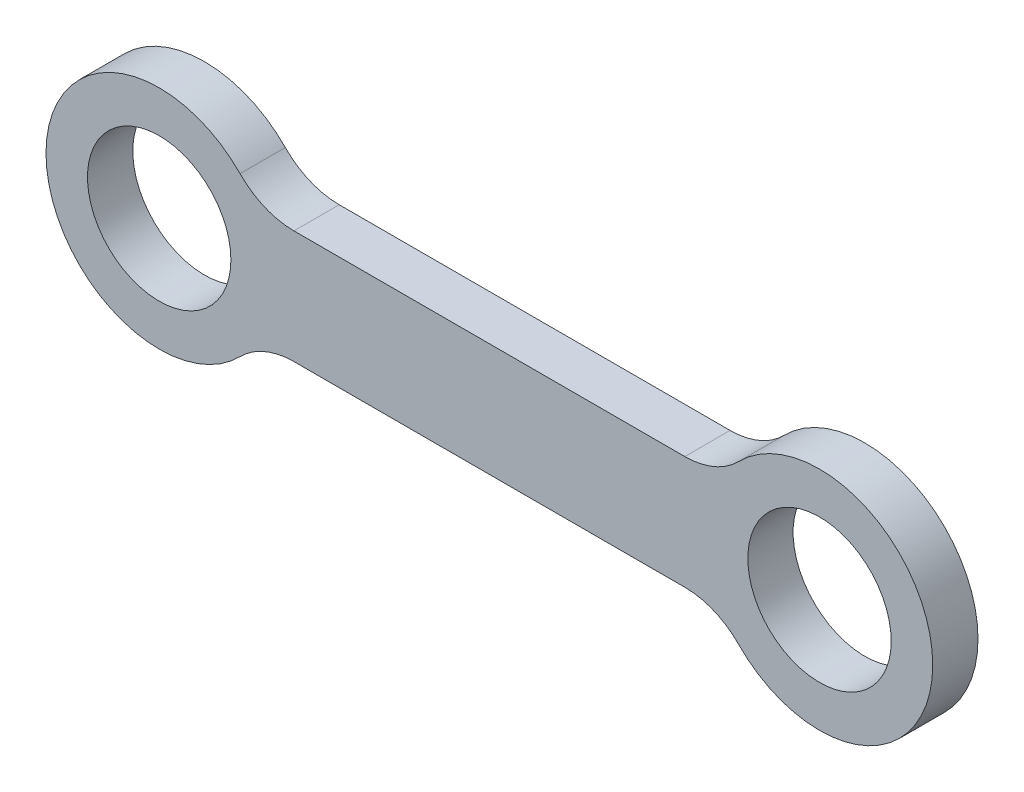
ISO-10303-21;
HEADER;
FILE_DESCRIPTION(('STEP AP214'),'2;1');
FILE_NAME('part.step','',(''),(''),'','','');
FILE_SCHEMA(('AUTOMOTIVE_DESIGN { 1 0 10303 214 1 1 1 1 }'));
ENDSEC;
DATA;
#1=APPLICATION_CONTEXT('core data for automotive mechanical design processes');
#2=APPLICATION_PROTOCOL_DEFINITION('international standard','automotive_design',2000,#1);
#3=PRODUCT_CONTEXT('',#1,'mechanical');
#4=PRODUCT('Part','Part','',(#3));
#5=PRODUCT_RELATED_PRODUCT_CATEGORY('part','',(#4));
#6=PRODUCT_DEFINITION_FORMATION('','',#4);
#7=PRODUCT_DEFINITION_CONTEXT('part definition',#1,'design');
#8=PRODUCT_DEFINITION('design','',#6,#7);
#9=PRODUCT_DEFINITION_SHAPE('','',#8);
#10=(LENGTH_UNIT() NAMED_UNIT(*) SI_UNIT(.MILLI.,.METRE.));
#11=(NAMED_UNIT(*) PLANE_ANGLE_UNIT() SI_UNIT($,.RADIAN.));
#12=(NAMED_UNIT(*) SI_UNIT($,.STERADIAN.) SOLID_ANGLE_UNIT());
#13=UNCERTAINTY_MEASURE_WITH_UNIT(LENGTH_MEASURE(1.E-05),#10,'distance_accuracy_value','');
#14=(GEOMETRIC_REPRESENTATION_CONTEXT(3) GLOBAL_UNCERTAINTY_ASSIGNED_CONTEXT((#13)) GLOBAL_UNIT_ASSIGNED_CONTEXT((#10,
#11,#12)) REPRESENTATION_CONTEXT('',''));
#15=CARTESIAN_POINT('',(0.,0.,0.));
#16=DIRECTION('',(0.,0.,1.));
#17=DIRECTION('',(1.,0.,0.));
#18=AXIS2_PLACEMENT_3D('',#15,#16,#17);
#19=CARTESIAN_POINT('',(-87.5,0.,3.));
#20=DIRECTION('',(0.,0.,-1.));
#21=DIRECTION('',(-1.,0.,0.));
#22=AXIS2_PLACEMENT_3D('',#19,#20,#21);
#23=CYLINDRICAL_SURFACE('',#22,15.);
#24=CARTESIAN_POINT('',(-87.5,0.,-3.));
#25=DIRECTION('',(0.,0.,1.));
#26=DIRECTION('',(1.,0.,0.));
#27=AXIS2_PLACEMENT_3D('',#24,#25,#26);
#28=CIRCLE('',#27,15.);
#29=CARTESIAN_POINT('',(-76.7878573571857,10.5,-3.));
#30=VERTEX_POINT('',#29);
#31=CARTESIAN_POINT('',(-76.7878573571857,-10.5,-3.));
#32=VERTEX_POINT('',#31);
#33=EDGE_CURVE('E161',#30,#32,#28,.T.);
#34=ORIENTED_EDGE('',*,*,#33,.T.);
#35=DIRECTION('',(0.,0.,-1.));
#36=VECTOR('',#35,1.);
#37=CARTESIAN_POINT('',(-76.7878573571857,-10.5,3.));
#38=LINE('',#37,#36);
#39=CARTESIAN_POINT('',(-76.7878573571857,-10.5,3.));
#40=VERTEX_POINT('',#39);
#41=EDGE_CURVE('E177',#32,#40,#38,.F.);
#42=ORIENTED_EDGE('',*,*,#41,.T.);
#43=CARTESIAN_POINT('',(-87.5,0.,3.));
#44=DIRECTION('',(0.,0.,1.));
#45=DIRECTION('',(1.,0.,0.));
#46=AXIS2_PLACEMENT_3D('',#43,#44,#45);
#47=CIRCLE('',#46,15.);
#48=CARTESIAN_POINT('',(-76.7878573571857,10.5,3.));
#49=VERTEX_POINT('',#48);
#50=EDGE_CURVE('E207',#49,#40,#47,.T.);
#51=ORIENTED_EDGE('',*,*,#50,.F.);
#52=DIRECTION('',(0.,0.,-1.));
#53=VECTOR('',#52,1.);
#54=CARTESIAN_POINT('',(-76.7878573571857,10.5,3.));
#55=LINE('',#54,#53);
#56=EDGE_CURVE('E173',#49,#30,#55,.T.);
#57=ORIENTED_EDGE('',*,*,#56,.T.);
#58=EDGE_LOOP('',(#34,#42,#51,#57));
#59=FACE_BOUND('',#58,.T.);
#60=ADVANCED_FACE('F41',(#59),#23,.T.);
#61=CARTESIAN_POINT('',(0.,-7.49999999999999,3.));
#62=DIRECTION('',(0.,1.,0.));
#63=DIRECTION('',(-1.,0.,0.));
#64=AXIS2_PLACEMENT_3D('',#61,#62,#63);
#65=PLANE('',#64);
#66=DIRECTION('',(1.,0.,0.));
#67=VECTOR('',#66,1.);
#68=CARTESIAN_POINT('',(0.,-7.49999999999999,-3.));
#69=LINE('',#68,#67);
#70=CARTESIAN_POINT('',(-69.6464289286428,-7.50000000000001,-3.));
#71=VERTEX_POINT('',#70);
#72=CARTESIAN_POINT('',(-17.8535710713571,-7.49999999999999,-3.));
#73=VERTEX_POINT('',#72);
#74=EDGE_CURVE('E155',#71,#73,#69,.T.);
#75=ORIENTED_EDGE('',*,*,#74,.T.);
#76=DIRECTION('',(0.,0.,1.));
#77=VECTOR('',#76,1.);
#78=CARTESIAN_POINT('',(-17.8535710713571,-7.49999999999999,3.));
#79=LINE('',#78,#77);
#80=CARTESIAN_POINT('',(-17.8535710713571,-7.49999999999999,3.));
#81=VERTEX_POINT('',#80);
#82=EDGE_CURVE('E129',#73,#81,#79,.T.);
#83=ORIENTED_EDGE('',*,*,#82,.T.);
#84=DIRECTION('',(1.,0.,0.));
#85=VECTOR('',#84,1.);
#86=CARTESIAN_POINT('',(0.,-7.49999999999999,3.));
#87=LINE('',#86,#85);
#88=CARTESIAN_POINT('',(-69.6464289286428,-7.50000000000001,3.));
#89=VERTEX_POINT('',#88);
#90=EDGE_CURVE('E212',#89,#81,#87,.T.);
#91=ORIENTED_EDGE('',*,*,#90,.F.);
#92=DIRECTION('',(0.,0.,1.));
#93=VECTOR('',#92,1.);
#94=CARTESIAN_POINT('',(-69.6464289286428,-7.50000000000001,-3.));
#95=LINE('',#94,#93);
#96=EDGE_CURVE('E146',#89,#71,#95,.F.);
#97=ORIENTED_EDGE('',*,*,#96,.T.);
#98=EDGE_LOOP('',(#75,#83,#91,#97));
#99=FACE_BOUND('',#98,.T.);
#100=ADVANCED_FACE('F239',(#99),#65,.F.);
#101=CARTESIAN_POINT('',(0.,0.,3.));
#102=DIRECTION('',(0.,0.,-1.));
#103=DIRECTION('',(-1.,0.,0.));
#104=AXIS2_PLACEMENT_3D('',#101,#102,#103);
#105=CYLINDRICAL_SURFACE('',#104,15.);
#106=CARTESIAN_POINT('',(0.,0.,3.));
#107=DIRECTION('',(0.,0.,1.));
#108=DIRECTION('',(1.,0.,0.));
#109=AXIS2_PLACEMENT_3D('',#106,#107,#108);
#110=CIRCLE('',#109,15.);
#111=CARTESIAN_POINT('',(-10.7121426428143,-10.5,3.));
#112=VERTEX_POINT('',#111);
#113=CARTESIAN_POINT('',(-10.7121426428143,10.5,3.));
#114=VERTEX_POINT('',#113);
#115=EDGE_CURVE('E144',#112,#114,#110,.T.);
#116=ORIENTED_EDGE('',*,*,#115,.F.);
#117=DIRECTION('',(0.,0.,-1.));
#118=VECTOR('',#117,1.);
#119=CARTESIAN_POINT('',(-10.7121426428143,-10.5,3.));
#120=LINE('',#119,#118);
#121=CARTESIAN_POINT('',(-10.7121426428143,-10.5,-3.));
#122=VERTEX_POINT('',#121);
#123=EDGE_CURVE('E128',#112,#122,#120,.T.);
#124=ORIENTED_EDGE('',*,*,#123,.T.);
#125=CARTESIAN_POINT('',(0.,0.,-3.));
#126=DIRECTION('',(0.,0.,1.));
#127=DIRECTION('',(1.,0.,0.));
#128=AXIS2_PLACEMENT_3D('',#125,#126,#127);
#129=CIRCLE('',#128,15.);
#130=CARTESIAN_POINT('',(-10.7121426428143,10.5,-3.));
#131=VERTEX_POINT('',#130);
#132=EDGE_CURVE('E142',#122,#131,#129,.T.);
#133=ORIENTED_EDGE('',*,*,#132,.T.);
#134=DIRECTION('',(0.,0.,-1.));
#135=VECTOR('',#134,1.);
#136=CARTESIAN_POINT('',(-10.7121426428143,10.5,3.));
#137=LINE('',#136,#135);
#138=EDGE_CURVE('E147',#131,#114,#137,.F.);
#139=ORIENTED_EDGE('',*,*,#138,.T.);
#140=EDGE_LOOP('',(#116,#124,#133,#139));
#141=FACE_BOUND('',#140,.T.);
#142=ADVANCED_FACE('F141',(#141),#105,.T.);
#143=CARTESIAN_POINT('',(-87.5,0.,3.));
#144=DIRECTION('',(0.,0.,-1.));
#145=DIRECTION('',(-1.,0.,0.));
#146=AXIS2_PLACEMENT_3D('',#143,#144,#145);
#147=CYLINDRICAL_SURFACE('',#146,9.49999999999998);
#148=CARTESIAN_POINT('',(-87.5,0.,3.));
#149=DIRECTION('',(0.,0.,1.));
#150=DIRECTION('',(1.,0.,0.));
#151=AXIS2_PLACEMENT_3D('',#148,#149,#150);
#152=CIRCLE('',#151,9.49999999999998);
#153=CARTESIAN_POINT('',(-78.,0.,3.));
#154=VERTEX_POINT('',#153);
#155=EDGE_CURVE('E213',#154,#154,#152,.T.);
#156=ORIENTED_EDGE('',*,*,#155,.T.);
#157=EDGE_LOOP('',(#156));
#158=FACE_BOUND('',#157,.T.);
#159=CARTESIAN_POINT('',(-87.5,0.,-3.));
#160=DIRECTION('',(0.,0.,1.));
#161=DIRECTION('',(1.,0.,0.));
#162=AXIS2_PLACEMENT_3D('',#159,#160,#161);
#163=CIRCLE('',#162,9.49999999999998);
#164=CARTESIAN_POINT('',(-78.,0.,-3.));
#165=VERTEX_POINT('',#164);
#166=EDGE_CURVE('E230',#165,#165,#163,.T.);
#167=ORIENTED_EDGE('',*,*,#166,.F.);
#168=EDGE_LOOP('',(#167));
#169=FACE_BOUND('',#168,.T.);
#170=ADVANCED_FACE('F246',(#158,#169),#147,.F.);
#171=CARTESIAN_POINT('',(0.,0.,3.));
#172=DIRECTION('',(0.,0.,-1.));
#173=DIRECTION('',(-1.,0.,0.));
#174=AXIS2_PLACEMENT_3D('',#171,#172,#173);
#175=CYLINDRICAL_SURFACE('',#174,9.5);
#176=CARTESIAN_POINT('',(0.,0.,3.));
#177=DIRECTION('',(0.,0.,1.));
#178=DIRECTION('',(1.,0.,0.));
#179=AXIS2_PLACEMENT_3D('',#176,#177,#178);
#180=CIRCLE('',#179,9.5);
#181=CARTESIAN_POINT('',(9.5,0.,3.));
#182=VERTEX_POINT('',#181);
#183=EDGE_CURVE('E158',#182,#182,#180,.T.);
#184=ORIENTED_EDGE('',*,*,#183,.T.);
#185=EDGE_LOOP('',(#184));
#186=FACE_BOUND('',#185,.T.);
#187=CARTESIAN_POINT('',(0.,0.,-3.));
#188=DIRECTION('',(0.,0.,1.));
#189=DIRECTION('',(1.,0.,0.));
#190=AXIS2_PLACEMENT_3D('',#187,#188,#189);
#191=CIRCLE('',#190,9.5);
#192=CARTESIAN_POINT('',(9.5,0.,-3.));
#193=VERTEX_POINT('',#192);
#194=EDGE_CURVE('E226',#193,#193,#191,.T.);
#195=ORIENTED_EDGE('',*,*,#194,.F.);
#196=EDGE_LOOP('',(#195));
#197=FACE_BOUND('',#196,.T.);
#198=ADVANCED_FACE('F253',(#186,#197),#175,.F.);
#199=CARTESIAN_POINT('',(0.,7.49999999999999,3.));
#200=DIRECTION('',(0.,1.,0.));
#201=DIRECTION('',(0.,0.,1.));
#202=AXIS2_PLACEMENT_3D('',#199,#200,#201);
#203=PLANE('',#202);
#204=DIRECTION('',(1.,0.,0.));
#205=VECTOR('',#204,1.);
#206=CARTESIAN_POINT('',(0.,7.49999999999999,3.));
#207=LINE('',#206,#205);
#208=CARTESIAN_POINT('',(-69.6464289286428,7.49999999999999,3.));
#209=VERTEX_POINT('',#208);
#210=CARTESIAN_POINT('',(-17.8535710713571,7.49999999999999,3.));
#211=VERTEX_POINT('',#210);
#212=EDGE_CURVE('E166',#209,#211,#207,.T.);
#213=ORIENTED_EDGE('',*,*,#212,.T.);
#214=DIRECTION('',(0.,0.,-1.));
#215=VECTOR('',#214,1.);
#216=CARTESIAN_POINT('',(-17.8535710713571,7.49999999999999,3.));
#217=LINE('',#216,#215);
#218=CARTESIAN_POINT('',(-17.8535710713571,7.49999999999999,-3.));
#219=VERTEX_POINT('',#218);
#220=EDGE_CURVE('E136',#211,#219,#217,.T.);
#221=ORIENTED_EDGE('',*,*,#220,.T.);
#222=DIRECTION('',(1.,0.,0.));
#223=VECTOR('',#222,1.);
#224=CARTESIAN_POINT('',(0.,7.49999999999999,-3.));
#225=LINE('',#224,#223);
#226=CARTESIAN_POINT('',(-69.6464289286428,7.49999999999999,-3.));
#227=VERTEX_POINT('',#226);
#228=EDGE_CURVE('E154',#227,#219,#225,.T.);
#229=ORIENTED_EDGE('',*,*,#228,.F.);
#230=DIRECTION('',(0.,0.,-1.));
#231=VECTOR('',#230,1.);
#232=CARTESIAN_POINT('',(-69.6464289286428,7.49999999999999,3.));
#233=LINE('',#232,#231);
#234=EDGE_CURVE('E70',#227,#209,#233,.F.);
#235=ORIENTED_EDGE('',*,*,#234,.T.);
#236=EDGE_LOOP('',(#213,#221,#229,#235));
#237=FACE_BOUND('',#236,.T.);
#238=ADVANCED_FACE('F201',(#237),#203,.T.);
#239=CARTESIAN_POINT('',(0.,0.,3.));
#240=DIRECTION('',(0.,0.,1.));
#241=DIRECTION('',(1.,0.,0.));
#242=AXIS2_PLACEMENT_3D('',#239,#240,#241);
#243=PLANE('',#242);
#244=ORIENTED_EDGE('',*,*,#183,.F.);
#245=EDGE_LOOP('',(#244));
#246=FACE_BOUND('',#245,.T.);
#247=ORIENTED_EDGE('',*,*,#155,.F.);
#248=EDGE_LOOP('',(#247));
#249=FACE_BOUND('',#248,.T.);
#250=ORIENTED_EDGE('',*,*,#212,.F.);
#251=CARTESIAN_POINT('',(-69.6464289286428,17.5,3.));
#252=DIRECTION('',(0.,0.,1.));
#253=DIRECTION('',(1.,0.,0.));
#254=AXIS2_PLACEMENT_3D('',#251,#252,#253);
#255=CIRCLE('',#254,10.);
#256=EDGE_CURVE('E11',#209,#49,#255,.F.);
#257=ORIENTED_EDGE('',*,*,#256,.T.);
#258=ORIENTED_EDGE('',*,*,#50,.T.);
#259=CARTESIAN_POINT('',(-69.6464289286428,-17.5,3.));
#260=DIRECTION('',(0.,0.,1.));
#261=DIRECTION('',(1.,0.,0.));
#262=AXIS2_PLACEMENT_3D('',#259,#260,#261);
#263=CIRCLE('',#262,10.);
#264=EDGE_CURVE('E190',#40,#89,#263,.F.);
#265=ORIENTED_EDGE('',*,*,#264,.T.);
#266=ORIENTED_EDGE('',*,*,#90,.T.);
#267=CARTESIAN_POINT('',(-17.8535710713571,-17.5,3.));
#268=DIRECTION('',(0.,0.,1.));
#269=DIRECTION('',(1.,0.,0.));
#270=AXIS2_PLACEMENT_3D('',#267,#268,#269);
#271=CIRCLE('',#270,10.);
#272=EDGE_CURVE('E135',#81,#112,#271,.F.);
#273=ORIENTED_EDGE('',*,*,#272,.T.);
#274=ORIENTED_EDGE('',*,*,#115,.T.);
#275=CARTESIAN_POINT('',(-17.8535710713571,17.5,3.));
#276=DIRECTION('',(0.,0.,1.));
#277=DIRECTION('',(1.,0.,0.));
#278=AXIS2_PLACEMENT_3D('',#275,#276,#277);
#279=CIRCLE('',#278,10.);
#280=EDGE_CURVE('E60',#114,#211,#279,.F.);
#281=ORIENTED_EDGE('',*,*,#280,.T.);
#282=EDGE_LOOP('',(#250,#257,#258,#265,#266,#273,#274,#281));
#283=FACE_BOUND('',#282,.T.);
#284=ADVANCED_FACE('F206',(#246,#249,#283),#243,.T.);
#285=CARTESIAN_POINT('',(0.,0.,-3.));
#286=DIRECTION('',(0.,0.,1.));
#287=DIRECTION('',(1.,0.,0.));
#288=AXIS2_PLACEMENT_3D('',#285,#286,#287);
#289=PLANE('',#288);
#290=ORIENTED_EDGE('',*,*,#194,.T.);
#291=EDGE_LOOP('',(#290));
#292=FACE_BOUND('',#291,.T.);
#293=ORIENTED_EDGE('',*,*,#166,.T.);
#294=EDGE_LOOP('',(#293));
#295=FACE_BOUND('',#294,.T.);
#296=ORIENTED_EDGE('',*,*,#33,.F.);
#297=CARTESIAN_POINT('',(-69.6464289286428,17.5,-3.));
#298=DIRECTION('',(0.,0.,1.));
#299=DIRECTION('',(1.,0.,0.));
#300=AXIS2_PLACEMENT_3D('',#297,#298,#299);
#301=CIRCLE('',#300,10.);
#302=EDGE_CURVE('E50',#30,#227,#301,.T.);
#303=ORIENTED_EDGE('',*,*,#302,.T.);
#304=ORIENTED_EDGE('',*,*,#228,.T.);
#305=CARTESIAN_POINT('',(-17.8535710713571,17.5,-3.));
#306=DIRECTION('',(0.,0.,1.));
#307=DIRECTION('',(1.,0.,0.));
#308=AXIS2_PLACEMENT_3D('',#305,#306,#307);
#309=CIRCLE('',#308,10.);
#310=EDGE_CURVE('E152',#219,#131,#309,.T.);
#311=ORIENTED_EDGE('',*,*,#310,.T.);
#312=ORIENTED_EDGE('',*,*,#132,.F.);
#313=CARTESIAN_POINT('',(-17.8535710713571,-17.5,-3.));
#314=DIRECTION('',(0.,0.,1.));
#315=DIRECTION('',(1.,0.,0.));
#316=AXIS2_PLACEMENT_3D('',#313,#314,#315);
#317=CIRCLE('',#316,10.);
#318=EDGE_CURVE('E124',#122,#73,#317,.T.);
#319=ORIENTED_EDGE('',*,*,#318,.T.);
#320=ORIENTED_EDGE('',*,*,#74,.F.);
#321=CARTESIAN_POINT('',(-69.6464289286428,-17.5,-3.));
#322=DIRECTION('',(0.,0.,1.));
#323=DIRECTION('',(1.,0.,0.));
#324=AXIS2_PLACEMENT_3D('',#321,#322,#323);
#325=CIRCLE('',#324,10.);
#326=EDGE_CURVE('E187',#71,#32,#325,.T.);
#327=ORIENTED_EDGE('',*,*,#326,.T.);
#328=EDGE_LOOP('',(#296,#303,#304,#311,#312,#319,#320,#327));
#329=FACE_BOUND('',#328,.T.);
#330=ADVANCED_FACE('F150',(#292,#295,#329),#289,.F.);
#331=CARTESIAN_POINT('',(-17.8535710713571,-17.5,3.));
#332=DIRECTION('',(0.,0.,-1.));
#333=DIRECTION('',(-1.,0.,0.));
#334=AXIS2_PLACEMENT_3D('',#331,#332,#333);
#335=CYLINDRICAL_SURFACE('',#334,10.);
#336=ORIENTED_EDGE('',*,*,#272,.F.);
#337=ORIENTED_EDGE('',*,*,#82,.F.);
#338=ORIENTED_EDGE('',*,*,#318,.F.);
#339=ORIENTED_EDGE('',*,*,#123,.F.);
#340=EDGE_LOOP('',(#336,#337,#338,#339));
#341=FACE_BOUND('',#340,.T.);
#342=ADVANCED_FACE('F127',(#341),#335,.F.);
#343=CARTESIAN_POINT('',(-69.6464289286428,-17.5,3.));
#344=DIRECTION('',(0.,0.,-1.));
#345=DIRECTION('',(-1.,0.,0.));
#346=AXIS2_PLACEMENT_3D('',#343,#344,#345);
#347=CYLINDRICAL_SURFACE('',#346,10.);
#348=ORIENTED_EDGE('',*,*,#264,.F.);
#349=ORIENTED_EDGE('',*,*,#41,.F.);
#350=ORIENTED_EDGE('',*,*,#326,.F.);
#351=ORIENTED_EDGE('',*,*,#96,.F.);
#352=EDGE_LOOP('',(#348,#349,#350,#351));
#353=FACE_BOUND('',#352,.T.);
#354=ADVANCED_FACE('F235',(#353),#347,.F.);
#355=CARTESIAN_POINT('',(-17.8535710713571,17.5,3.));
#356=DIRECTION('',(0.,0.,-1.));
#357=DIRECTION('',(-1.,0.,0.));
#358=AXIS2_PLACEMENT_3D('',#355,#356,#357);
#359=CYLINDRICAL_SURFACE('',#358,10.);
#360=ORIENTED_EDGE('',*,*,#280,.F.);
#361=ORIENTED_EDGE('',*,*,#138,.F.);
#362=ORIENTED_EDGE('',*,*,#310,.F.);
#363=ORIENTED_EDGE('',*,*,#220,.F.);
#364=EDGE_LOOP('',(#360,#361,#362,#363));
#365=FACE_BOUND('',#364,.T.);
#366=ADVANCED_FACE('F261',(#365),#359,.F.);
#367=CARTESIAN_POINT('',(-69.6464289286428,17.5,3.));
#368=DIRECTION('',(0.,0.,-1.));
#369=DIRECTION('',(-1.,0.,0.));
#370=AXIS2_PLACEMENT_3D('',#367,#368,#369);
#371=CYLINDRICAL_SURFACE('',#370,10.);
#372=ORIENTED_EDGE('',*,*,#256,.F.);
#373=ORIENTED_EDGE('',*,*,#234,.F.);
#374=ORIENTED_EDGE('',*,*,#302,.F.);
#375=ORIENTED_EDGE('',*,*,#56,.F.);
#376=EDGE_LOOP('',(#372,#373,#374,#375));
#377=FACE_BOUND('',#376,.T.);
#378=ADVANCED_FACE('F43',(#377),#371,.F.);
#379=CLOSED_SHELL('',(#60,#100,#142,#170,#198,#238,#284,#330,#342,#354,#366,#378));
#380=MANIFOLD_SOLID_BREP('B2',#379);
#381=ADVANCED_BREP_SHAPE_REPRESENTATION('',(#18,#380),#14);
#382=SHAPE_DEFINITION_REPRESENTATION(#9,#381);
ENDSEC;
END-ISO-10303-21;
